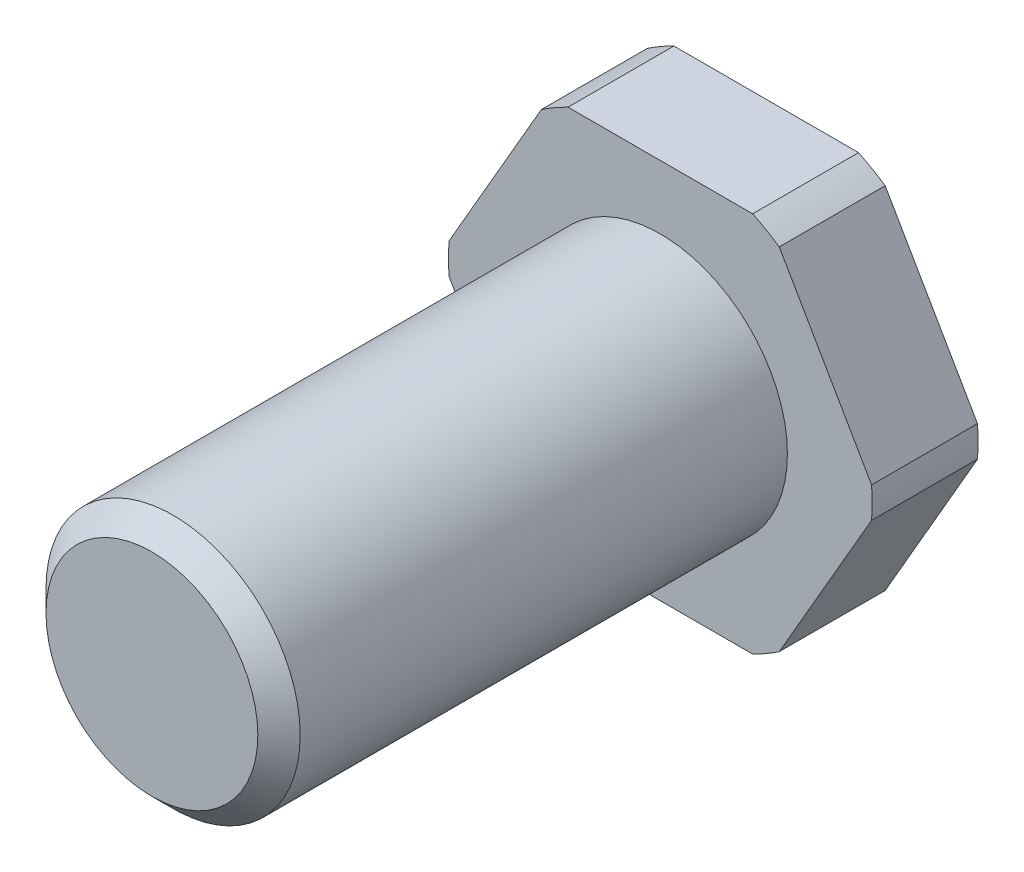
ISO-10303-21;
HEADER;
FILE_DESCRIPTION(('STEP AP214'),'2;1');
FILE_NAME('part.step','',(''),(''),'','','');
FILE_SCHEMA(('AUTOMOTIVE_DESIGN { 1 0 10303 214 1 1 1 1 }'));
ENDSEC;
DATA;
#1=APPLICATION_CONTEXT('core data for automotive mechanical design processes');
#2=APPLICATION_PROTOCOL_DEFINITION('international standard','automotive_design',2000,#1);
#3=PRODUCT_CONTEXT('',#1,'mechanical');
#4=PRODUCT('Part','Part','',(#3));
#5=PRODUCT_RELATED_PRODUCT_CATEGORY('part','',(#4));
#6=PRODUCT_DEFINITION_FORMATION('','',#4);
#7=PRODUCT_DEFINITION_CONTEXT('part definition',#1,'design');
#8=PRODUCT_DEFINITION('design','',#6,#7);
#9=PRODUCT_DEFINITION_SHAPE('','',#8);
#10=(LENGTH_UNIT() NAMED_UNIT(*) SI_UNIT(.MILLI.,.METRE.));
#11=(NAMED_UNIT(*) PLANE_ANGLE_UNIT() SI_UNIT($,.RADIAN.));
#12=(NAMED_UNIT(*) SI_UNIT($,.STERADIAN.) SOLID_ANGLE_UNIT());
#13=UNCERTAINTY_MEASURE_WITH_UNIT(LENGTH_MEASURE(1.E-05),#10,'distance_accuracy_value','');
#14=(GEOMETRIC_REPRESENTATION_CONTEXT(3) GLOBAL_UNCERTAINTY_ASSIGNED_CONTEXT((#13)) GLOBAL_UNIT_ASSIGNED_CONTEXT((#10,
#11,#12)) REPRESENTATION_CONTEXT('',''));
#15=CARTESIAN_POINT('',(0.,0.,0.));
#16=DIRECTION('',(0.,0.,1.));
#17=DIRECTION('',(1.,0.,0.));
#18=AXIS2_PLACEMENT_3D('',#15,#16,#17);
#19=CARTESIAN_POINT('',(10.3923048454133,0.,5.));
#20=DIRECTION('',(0.,0.,1.));
#21=DIRECTION('',(1.,0.,0.));
#22=AXIS2_PLACEMENT_3D('',#19,#20,#21);
#23=PLANE('',#22);
#24=CARTESIAN_POINT('',(0.,0.,5.));
#25=DIRECTION('',(0.,0.,1.));
#26=DIRECTION('',(1.,0.,0.));
#27=AXIS2_PLACEMENT_3D('',#24,#25,#26);
#28=CIRCLE('',#27,6.);
#29=CARTESIAN_POINT('',(6.,0.,5.));
#30=VERTEX_POINT('',#29);
#31=EDGE_CURVE('E157',#30,#30,#28,.T.);
#32=ORIENTED_EDGE('',*,*,#31,.F.);
#33=EDGE_LOOP('',(#32));
#34=FACE_BOUND('',#33,.T.);
#35=DIRECTION('',(-0.5,0.866025403784438,0.));
#36=VECTOR('',#35,1.);
#37=CARTESIAN_POINT('',(10.3923048454133,0.,5.));
#38=LINE('',#37,#36);
#39=CARTESIAN_POINT('',(9.97367810583028,0.72508278236463,5.));
#40=VERTEX_POINT('',#39);
#41=CARTESIAN_POINT('',(5.61477916228961,8.27491721763537,5.));
#42=VERTEX_POINT('',#41);
#43=EDGE_CURVE('E147',#40,#42,#38,.T.);
#44=ORIENTED_EDGE('',*,*,#43,.T.);
#45=CARTESIAN_POINT('',(0.,0.,5.));
#46=DIRECTION('',(0.,0.,1.));
#47=DIRECTION('',(1.,0.,0.));
#48=AXIS2_PLACEMENT_3D('',#45,#46,#47);
#49=CIRCLE('',#48,10.);
#50=CARTESIAN_POINT('',(4.35889894354067,9.,5.));
#51=VERTEX_POINT('',#50);
#52=EDGE_CURVE('E226',#42,#51,#49,.T.);
#53=ORIENTED_EDGE('',*,*,#52,.T.);
#54=DIRECTION('',(-1.,0.,0.));
#55=VECTOR('',#54,1.);
#56=CARTESIAN_POINT('',(5.19615242270663,9.,5.));
#57=LINE('',#56,#55);
#58=CARTESIAN_POINT('',(-4.35889894354067,9.,5.));
#59=VERTEX_POINT('',#58);
#60=EDGE_CURVE('E209',#51,#59,#57,.T.);
#61=ORIENTED_EDGE('',*,*,#60,.T.);
#62=CARTESIAN_POINT('',(-5.61477916228962,8.27491721763537,5.));
#63=VERTEX_POINT('',#62);
#64=EDGE_CURVE('E231',#59,#63,#49,.T.);
#65=ORIENTED_EDGE('',*,*,#64,.T.);
#66=DIRECTION('',(-0.5,-0.866025403784439,0.));
#67=VECTOR('',#66,1.);
#68=CARTESIAN_POINT('',(-5.19615242270663,9.,5.));
#69=LINE('',#68,#67);
#70=CARTESIAN_POINT('',(-9.97367810583028,0.725082782364628,5.));
#71=VERTEX_POINT('',#70);
#72=EDGE_CURVE('E212',#63,#71,#69,.T.);
#73=ORIENTED_EDGE('',*,*,#72,.T.);
#74=CARTESIAN_POINT('',(-9.97367810583028,-0.725082782364632,5.));
#75=VERTEX_POINT('',#74);
#76=EDGE_CURVE('E258',#71,#75,#49,.T.);
#77=ORIENTED_EDGE('',*,*,#76,.T.);
#78=DIRECTION('',(0.5,-0.866025403784439,0.));
#79=VECTOR('',#78,1.);
#80=CARTESIAN_POINT('',(-10.3923048454133,0.,5.));
#81=LINE('',#80,#79);
#82=CARTESIAN_POINT('',(-5.61477916228961,-8.27491721763537,5.));
#83=VERTEX_POINT('',#82);
#84=EDGE_CURVE('E215',#75,#83,#81,.T.);
#85=ORIENTED_EDGE('',*,*,#84,.T.);
#86=CARTESIAN_POINT('',(-4.35889894354067,-9.00000000000001,5.));
#87=VERTEX_POINT('',#86);
#88=EDGE_CURVE('E222',#83,#87,#49,.T.);
#89=ORIENTED_EDGE('',*,*,#88,.T.);
#90=DIRECTION('',(1.,0.,0.));
#91=VECTOR('',#90,1.);
#92=CARTESIAN_POINT('',(-5.19615242270663,-9.00000000000001,5.));
#93=LINE('',#92,#91);
#94=CARTESIAN_POINT('',(4.35889894354067,-9.,5.));
#95=VERTEX_POINT('',#94);
#96=EDGE_CURVE('E138',#87,#95,#93,.T.);
#97=ORIENTED_EDGE('',*,*,#96,.T.);
#98=CARTESIAN_POINT('',(5.61477916228962,-8.27491721763537,5.));
#99=VERTEX_POINT('',#98);
#100=EDGE_CURVE('E221',#95,#99,#49,.T.);
#101=ORIENTED_EDGE('',*,*,#100,.T.);
#102=DIRECTION('',(0.5,0.866025403784439,0.));
#103=VECTOR('',#102,1.);
#104=CARTESIAN_POINT('',(5.19615242270664,-9.,5.));
#105=LINE('',#104,#103);
#106=CARTESIAN_POINT('',(9.97367810583028,-0.725082782364636,5.));
#107=VERTEX_POINT('',#106);
#108=EDGE_CURVE('E168',#99,#107,#105,.T.);
#109=ORIENTED_EDGE('',*,*,#108,.T.);
#110=EDGE_CURVE('E233',#107,#40,#49,.T.);
#111=ORIENTED_EDGE('',*,*,#110,.T.);
#112=EDGE_LOOP('',(#44,#53,#61,#65,#73,#77,#85,#89,#97,#101,#109,#111));
#113=FACE_BOUND('',#112,.T.);
#114=ADVANCED_FACE('F35',(#34,#113),#23,.T.);
#115=CARTESIAN_POINT('',(5.19615242270664,-9.,5.));
#116=DIRECTION('',(-0.866025403784439,0.5,0.));
#117=DIRECTION('',(-0.5,-0.866025403784439,0.));
#118=AXIS2_PLACEMENT_3D('',#115,#116,#117);
#119=PLANE('',#118);
#120=DIRECTION('',(0.,0.,1.));
#121=VECTOR('',#120,1.);
#122=CARTESIAN_POINT('',(5.61477916228962,-8.27491721763537,0.));
#123=LINE('',#122,#121);
#124=CARTESIAN_POINT('',(5.61477916228962,-8.27491721763537,0.));
#125=VERTEX_POINT('',#124);
#126=EDGE_CURVE('E187',#125,#99,#123,.T.);
#127=ORIENTED_EDGE('',*,*,#126,.F.);
#128=DIRECTION('',(0.5,0.866025403784439,0.));
#129=VECTOR('',#128,1.);
#130=CARTESIAN_POINT('',(5.19615242270664,-9.,0.));
#131=LINE('',#130,#129);
#132=CARTESIAN_POINT('',(9.97367810583028,-0.725082782364633,0.));
#133=VERTEX_POINT('',#132);
#134=EDGE_CURVE('E152',#125,#133,#131,.T.);
#135=ORIENTED_EDGE('',*,*,#134,.T.);
#136=DIRECTION('',(0.,0.,1.));
#137=VECTOR('',#136,1.);
#138=CARTESIAN_POINT('',(9.97367810583028,-0.725082782364636,0.));
#139=LINE('',#138,#137);
#140=EDGE_CURVE('E132',#107,#133,#139,.F.);
#141=ORIENTED_EDGE('',*,*,#140,.F.);
#142=ORIENTED_EDGE('',*,*,#108,.F.);
#143=EDGE_LOOP('',(#127,#135,#141,#142));
#144=FACE_BOUND('',#143,.T.);
#145=ADVANCED_FACE('F194',(#144),#119,.F.);
#146=CARTESIAN_POINT('',(10.3923048454133,0.,5.));
#147=DIRECTION('',(-0.866025403784438,-0.5,0.));
#148=DIRECTION('',(0.5,-0.866025403784439,0.));
#149=AXIS2_PLACEMENT_3D('',#146,#147,#148);
#150=PLANE('',#149);
#151=DIRECTION('',(0.,0.,1.));
#152=VECTOR('',#151,1.);
#153=CARTESIAN_POINT('',(9.97367810583028,0.72508278236463,0.));
#154=LINE('',#153,#152);
#155=CARTESIAN_POINT('',(9.97367810583028,0.72508278236463,0.));
#156=VERTEX_POINT('',#155);
#157=EDGE_CURVE('E129',#156,#40,#154,.T.);
#158=ORIENTED_EDGE('',*,*,#157,.F.);
#159=DIRECTION('',(-0.5,0.866025403784438,0.));
#160=VECTOR('',#159,1.);
#161=CARTESIAN_POINT('',(10.3923048454133,0.,0.));
#162=LINE('',#161,#160);
#163=CARTESIAN_POINT('',(5.61477916228961,8.27491721763537,0.));
#164=VERTEX_POINT('',#163);
#165=EDGE_CURVE('E145',#156,#164,#162,.T.);
#166=ORIENTED_EDGE('',*,*,#165,.T.);
#167=DIRECTION('',(0.,0.,1.));
#168=VECTOR('',#167,1.);
#169=CARTESIAN_POINT('',(5.61477916228961,8.27491721763537,0.));
#170=LINE('',#169,#168);
#171=EDGE_CURVE('E50',#42,#164,#170,.F.);
#172=ORIENTED_EDGE('',*,*,#171,.F.);
#173=ORIENTED_EDGE('',*,*,#43,.F.);
#174=EDGE_LOOP('',(#158,#166,#172,#173));
#175=FACE_BOUND('',#174,.T.);
#176=ADVANCED_FACE('F144',(#175),#150,.F.);
#177=CARTESIAN_POINT('',(5.19615242270663,9.,5.));
#178=DIRECTION('',(0.,-1.,0.));
#179=DIRECTION('',(1.,0.,0.));
#180=AXIS2_PLACEMENT_3D('',#177,#178,#179);
#181=PLANE('',#180);
#182=DIRECTION('',(0.,0.,1.));
#183=VECTOR('',#182,1.);
#184=CARTESIAN_POINT('',(4.35889894354067,9.,0.));
#185=LINE('',#184,#183);
#186=CARTESIAN_POINT('',(4.35889894354067,9.,0.));
#187=VERTEX_POINT('',#186);
#188=EDGE_CURVE('E243',#187,#51,#185,.T.);
#189=ORIENTED_EDGE('',*,*,#188,.F.);
#190=DIRECTION('',(-1.,0.,0.));
#191=VECTOR('',#190,1.);
#192=CARTESIAN_POINT('',(5.19615242270663,9.,0.));
#193=LINE('',#192,#191);
#194=CARTESIAN_POINT('',(-4.35889894354067,9.,0.));
#195=VERTEX_POINT('',#194);
#196=EDGE_CURVE('E151',#187,#195,#193,.T.);
#197=ORIENTED_EDGE('',*,*,#196,.T.);
#198=DIRECTION('',(0.,0.,1.));
#199=VECTOR('',#198,1.);
#200=CARTESIAN_POINT('',(-4.35889894354067,9.,0.));
#201=LINE('',#200,#199);
#202=EDGE_CURVE('E58',#59,#195,#201,.F.);
#203=ORIENTED_EDGE('',*,*,#202,.F.);
#204=ORIENTED_EDGE('',*,*,#60,.F.);
#205=EDGE_LOOP('',(#189,#197,#203,#204));
#206=FACE_BOUND('',#205,.T.);
#207=ADVANCED_FACE('F249',(#206),#181,.F.);
#208=CARTESIAN_POINT('',(-5.19615242270663,9.,5.));
#209=DIRECTION('',(0.866025403784439,-0.5,0.));
#210=DIRECTION('',(0.5,0.866025403784439,0.));
#211=AXIS2_PLACEMENT_3D('',#208,#209,#210);
#212=PLANE('',#211);
#213=DIRECTION('',(0.,0.,1.));
#214=VECTOR('',#213,1.);
#215=CARTESIAN_POINT('',(-5.61477916228962,8.27491721763537,0.));
#216=LINE('',#215,#214);
#217=CARTESIAN_POINT('',(-5.61477916228961,8.27491721763537,0.));
#218=VERTEX_POINT('',#217);
#219=EDGE_CURVE('E240',#218,#63,#216,.T.);
#220=ORIENTED_EDGE('',*,*,#219,.F.);
#221=DIRECTION('',(-0.5,-0.866025403784439,0.));
#222=VECTOR('',#221,1.);
#223=CARTESIAN_POINT('',(-5.19615242270663,9.,0.));
#224=LINE('',#223,#222);
#225=CARTESIAN_POINT('',(-9.97367810583028,0.725082782364626,0.));
#226=VERTEX_POINT('',#225);
#227=EDGE_CURVE('E155',#218,#226,#224,.T.);
#228=ORIENTED_EDGE('',*,*,#227,.T.);
#229=DIRECTION('',(0.,0.,1.));
#230=VECTOR('',#229,1.);
#231=CARTESIAN_POINT('',(-9.97367810583028,0.725082782364628,0.));
#232=LINE('',#231,#230);
#233=EDGE_CURVE('E238',#71,#226,#232,.F.);
#234=ORIENTED_EDGE('',*,*,#233,.F.);
#235=ORIENTED_EDGE('',*,*,#72,.F.);
#236=EDGE_LOOP('',(#220,#228,#234,#235));
#237=FACE_BOUND('',#236,.T.);
#238=ADVANCED_FACE('F254',(#237),#212,.F.);
#239=CARTESIAN_POINT('',(-10.3923048454133,0.,5.));
#240=DIRECTION('',(0.866025403784439,0.5,0.));
#241=DIRECTION('',(-0.5,0.866025403784439,0.));
#242=AXIS2_PLACEMENT_3D('',#239,#240,#241);
#243=PLANE('',#242);
#244=DIRECTION('',(0.,0.,1.));
#245=VECTOR('',#244,1.);
#246=CARTESIAN_POINT('',(-9.97367810583028,-0.725082782364632,0.));
#247=LINE('',#246,#245);
#248=CARTESIAN_POINT('',(-9.97367810583028,-0.725082782364631,0.));
#249=VERTEX_POINT('',#248);
#250=EDGE_CURVE('E236',#249,#75,#247,.T.);
#251=ORIENTED_EDGE('',*,*,#250,.F.);
#252=DIRECTION('',(0.5,-0.866025403784439,0.));
#253=VECTOR('',#252,1.);
#254=CARTESIAN_POINT('',(-10.3923048454133,0.,0.));
#255=LINE('',#254,#253);
#256=CARTESIAN_POINT('',(-5.61477916228962,-8.27491721763537,0.));
#257=VERTEX_POINT('',#256);
#258=EDGE_CURVE('E163',#249,#257,#255,.T.);
#259=ORIENTED_EDGE('',*,*,#258,.T.);
#260=DIRECTION('',(0.,0.,1.));
#261=VECTOR('',#260,1.);
#262=CARTESIAN_POINT('',(-5.61477916228961,-8.27491721763537,0.));
#263=LINE('',#262,#261);
#264=EDGE_CURVE('E228',#83,#257,#263,.F.);
#265=ORIENTED_EDGE('',*,*,#264,.F.);
#266=ORIENTED_EDGE('',*,*,#84,.F.);
#267=EDGE_LOOP('',(#251,#259,#265,#266));
#268=FACE_BOUND('',#267,.T.);
#269=ADVANCED_FACE('F262',(#268),#243,.F.);
#270=CARTESIAN_POINT('',(-5.19615242270663,-9.00000000000001,5.));
#271=DIRECTION('',(0.,1.,0.));
#272=DIRECTION('',(-1.,0.,0.));
#273=AXIS2_PLACEMENT_3D('',#270,#271,#272);
#274=PLANE('',#273);
#275=DIRECTION('',(0.,0.,1.));
#276=VECTOR('',#275,1.);
#277=CARTESIAN_POINT('',(-4.35889894354067,-9.00000000000001,0.));
#278=LINE('',#277,#276);
#279=CARTESIAN_POINT('',(-4.35889894354067,-9.00000000000001,0.));
#280=VERTEX_POINT('',#279);
#281=EDGE_CURVE('E225',#280,#87,#278,.T.);
#282=ORIENTED_EDGE('',*,*,#281,.F.);
#283=DIRECTION('',(1.,0.,0.));
#284=VECTOR('',#283,1.);
#285=CARTESIAN_POINT('',(-5.19615242270663,-9.00000000000001,0.));
#286=LINE('',#285,#284);
#287=CARTESIAN_POINT('',(4.35889894354067,-9.,0.));
#288=VERTEX_POINT('',#287);
#289=EDGE_CURVE('E166',#280,#288,#286,.T.);
#290=ORIENTED_EDGE('',*,*,#289,.T.);
#291=DIRECTION('',(0.,0.,1.));
#292=VECTOR('',#291,1.);
#293=CARTESIAN_POINT('',(4.35889894354067,-9.,0.));
#294=LINE('',#293,#292);
#295=EDGE_CURVE('E190',#95,#288,#294,.F.);
#296=ORIENTED_EDGE('',*,*,#295,.F.);
#297=ORIENTED_EDGE('',*,*,#96,.F.);
#298=EDGE_LOOP('',(#282,#290,#296,#297));
#299=FACE_BOUND('',#298,.T.);
#300=ADVANCED_FACE('F224',(#299),#274,.F.);
#301=CARTESIAN_POINT('',(10.3923048454133,0.,0.));
#302=DIRECTION('',(0.,0.,1.));
#303=DIRECTION('',(1.,0.,0.));
#304=AXIS2_PLACEMENT_3D('',#301,#302,#303);
#305=PLANE('',#304);
#306=CARTESIAN_POINT('',(0.,0.,0.));
#307=DIRECTION('',(0.,0.,-1.));
#308=DIRECTION('',(-1.,0.,0.));
#309=AXIS2_PLACEMENT_3D('',#306,#307,#308);
#310=CIRCLE('',#309,3.39999999999999);
#311=CARTESIAN_POINT('',(-3.39999999999999,0.,0.));
#312=VERTEX_POINT('',#311);
#313=EDGE_CURVE('E196',#312,#312,#310,.T.);
#314=ORIENTED_EDGE('',*,*,#313,.F.);
#315=EDGE_LOOP('',(#314));
#316=FACE_BOUND('',#315,.T.);
#317=CARTESIAN_POINT('',(0.,0.,0.));
#318=DIRECTION('',(0.,0.,1.));
#319=DIRECTION('',(1.,0.,0.));
#320=AXIS2_PLACEMENT_3D('',#317,#318,#319);
#321=CIRCLE('',#320,10.);
#322=EDGE_CURVE('E140',#164,#187,#321,.T.);
#323=ORIENTED_EDGE('',*,*,#322,.F.);
#324=ORIENTED_EDGE('',*,*,#165,.F.);
#325=EDGE_CURVE('E126',#133,#156,#321,.T.);
#326=ORIENTED_EDGE('',*,*,#325,.F.);
#327=ORIENTED_EDGE('',*,*,#134,.F.);
#328=EDGE_CURVE('E137',#288,#125,#321,.T.);
#329=ORIENTED_EDGE('',*,*,#328,.F.);
#330=ORIENTED_EDGE('',*,*,#289,.F.);
#331=EDGE_CURVE('E176',#257,#280,#321,.T.);
#332=ORIENTED_EDGE('',*,*,#331,.F.);
#333=ORIENTED_EDGE('',*,*,#258,.F.);
#334=EDGE_CURVE('E174',#226,#249,#321,.T.);
#335=ORIENTED_EDGE('',*,*,#334,.F.);
#336=ORIENTED_EDGE('',*,*,#227,.F.);
#337=EDGE_CURVE('E172',#195,#218,#321,.T.);
#338=ORIENTED_EDGE('',*,*,#337,.F.);
#339=ORIENTED_EDGE('',*,*,#196,.F.);
#340=EDGE_LOOP('',(#323,#324,#326,#327,#329,#330,#332,#333,#335,#336,#338,#339));
#341=FACE_BOUND('',#340,.T.);
#342=ADVANCED_FACE('F149',(#316,#341),#305,.F.);
#343=CARTESIAN_POINT('',(0.,0.,29.));
#344=DIRECTION('',(0.,0.,-1.));
#345=DIRECTION('',(-1.,0.,0.));
#346=AXIS2_PLACEMENT_3D('',#343,#344,#345);
#347=CYLINDRICAL_SURFACE('',#346,6.);
#348=CARTESIAN_POINT('',(0.,0.,28.));
#349=DIRECTION('',(0.,0.,1.));
#350=DIRECTION('',(1.,0.,0.));
#351=AXIS2_PLACEMENT_3D('',#348,#349,#350);
#352=CIRCLE('',#351,6.);
#353=CARTESIAN_POINT('',(6.,0.,28.));
#354=VERTEX_POINT('',#353);
#355=EDGE_CURVE('E12',#354,#354,#352,.F.);
#356=ORIENTED_EDGE('',*,*,#355,.T.);
#357=EDGE_LOOP('',(#356));
#358=FACE_BOUND('',#357,.T.);
#359=ORIENTED_EDGE('',*,*,#31,.T.);
#360=EDGE_LOOP('',(#359));
#361=FACE_BOUND('',#360,.T.);
#362=ADVANCED_FACE('F281',(#358,#361),#347,.T.);
#363=CARTESIAN_POINT('',(0.,0.,29.));
#364=DIRECTION('',(0.,0.,1.));
#365=DIRECTION('',(1.,0.,0.));
#366=AXIS2_PLACEMENT_3D('',#363,#364,#365);
#367=PLANE('',#366);
#368=CARTESIAN_POINT('',(0.,0.,29.));
#369=DIRECTION('',(0.,0.,1.));
#370=DIRECTION('',(1.,0.,0.));
#371=AXIS2_PLACEMENT_3D('',#368,#369,#370);
#372=CIRCLE('',#371,5.);
#373=CARTESIAN_POINT('',(5.,0.,29.));
#374=VERTEX_POINT('',#373);
#375=EDGE_CURVE('E43',#374,#374,#372,.T.);
#376=ORIENTED_EDGE('',*,*,#375,.T.);
#377=EDGE_LOOP('',(#376));
#378=FACE_BOUND('',#377,.T.);
#379=ADVANCED_FACE('F326',(#378),#367,.T.);
#380=CARTESIAN_POINT('',(0.,0.,15.));
#381=DIRECTION('',(0.,0.,-1.));
#382=DIRECTION('',(-1.,0.,0.));
#383=AXIS2_PLACEMENT_3D('',#380,#381,#382);
#384=CONICAL_SURFACE('',#383,3.4,1.02974425867665);
#385=CARTESIAN_POINT('',(0.,0.,17.0429261046937));
#386=VERTEX_POINT('',#385);
#387=VERTEX_LOOP('',#386);
#388=FACE_BOUND('',#387,.T.);
#389=CARTESIAN_POINT('',(0.,0.,15.));
#390=DIRECTION('',(0.,0.,-1.));
#391=DIRECTION('',(-1.,0.,0.));
#392=AXIS2_PLACEMENT_3D('',#389,#390,#391);
#393=CIRCLE('',#392,3.4);
#394=CARTESIAN_POINT('',(-3.4,0.,15.));
#395=VERTEX_POINT('',#394);
#396=EDGE_CURVE('E199',#395,#395,#393,.T.);
#397=ORIENTED_EDGE('',*,*,#396,.T.);
#398=EDGE_LOOP('',(#397));
#399=FACE_BOUND('',#398,.T.);
#400=ADVANCED_FACE('F334',(#388,#399),#384,.F.);
#401=CARTESIAN_POINT('',(0.,0.,0.));
#402=DIRECTION('',(0.,0.,-1.));
#403=DIRECTION('',(-1.,0.,0.));
#404=AXIS2_PLACEMENT_3D('',#401,#402,#403);
#405=CYLINDRICAL_SURFACE('',#404,3.39999999999999);
#406=ORIENTED_EDGE('',*,*,#396,.F.);
#407=EDGE_LOOP('',(#406));
#408=FACE_BOUND('',#407,.T.);
#409=ORIENTED_EDGE('',*,*,#313,.T.);
#410=EDGE_LOOP('',(#409));
#411=FACE_BOUND('',#410,.T.);
#412=ADVANCED_FACE('F341',(#408,#411),#405,.F.);
#413=CARTESIAN_POINT('',(0.,0.,0.));
#414=DIRECTION('',(0.,0.,1.));
#415=DIRECTION('',(1.,0.,0.));
#416=AXIS2_PLACEMENT_3D('',#413,#414,#415);
#417=CYLINDRICAL_SURFACE('',#416,10.);
#418=ORIENTED_EDGE('',*,*,#140,.T.);
#419=ORIENTED_EDGE('',*,*,#325,.T.);
#420=ORIENTED_EDGE('',*,*,#157,.T.);
#421=ORIENTED_EDGE('',*,*,#110,.F.);
#422=EDGE_LOOP('',(#418,#419,#420,#421));
#423=FACE_BOUND('',#422,.T.);
#424=ADVANCED_FACE('F128',(#423),#417,.T.);
#425=ORIENTED_EDGE('',*,*,#126,.T.);
#426=ORIENTED_EDGE('',*,*,#100,.F.);
#427=ORIENTED_EDGE('',*,*,#295,.T.);
#428=ORIENTED_EDGE('',*,*,#328,.T.);
#429=EDGE_LOOP('',(#425,#426,#427,#428));
#430=FACE_BOUND('',#429,.T.);
#431=ADVANCED_FACE('F186',(#430),#417,.T.);
#432=ORIENTED_EDGE('',*,*,#264,.T.);
#433=ORIENTED_EDGE('',*,*,#331,.T.);
#434=ORIENTED_EDGE('',*,*,#281,.T.);
#435=ORIENTED_EDGE('',*,*,#88,.F.);
#436=EDGE_LOOP('',(#432,#433,#434,#435));
#437=FACE_BOUND('',#436,.T.);
#438=ADVANCED_FACE('F263',(#437),#417,.T.);
#439=ORIENTED_EDGE('',*,*,#233,.T.);
#440=ORIENTED_EDGE('',*,*,#334,.T.);
#441=ORIENTED_EDGE('',*,*,#250,.T.);
#442=ORIENTED_EDGE('',*,*,#76,.F.);
#443=EDGE_LOOP('',(#439,#440,#441,#442));
#444=FACE_BOUND('',#443,.T.);
#445=ADVANCED_FACE('F265',(#444),#417,.T.);
#446=ORIENTED_EDGE('',*,*,#202,.T.);
#447=ORIENTED_EDGE('',*,*,#337,.T.);
#448=ORIENTED_EDGE('',*,*,#219,.T.);
#449=ORIENTED_EDGE('',*,*,#64,.F.);
#450=EDGE_LOOP('',(#446,#447,#448,#449));
#451=FACE_BOUND('',#450,.T.);
#452=ADVANCED_FACE('F256',(#451),#417,.T.);
#453=ORIENTED_EDGE('',*,*,#171,.T.);
#454=ORIENTED_EDGE('',*,*,#322,.T.);
#455=ORIENTED_EDGE('',*,*,#188,.T.);
#456=ORIENTED_EDGE('',*,*,#52,.F.);
#457=EDGE_LOOP('',(#453,#454,#455,#456));
#458=FACE_BOUND('',#457,.T.);
#459=ADVANCED_FACE('F245',(#458),#417,.T.);
#460=CARTESIAN_POINT('',(0.,0.,29.));
#461=DIRECTION('',(0.,0.,-1.));
#462=DIRECTION('',(-1.,0.,0.));
#463=AXIS2_PLACEMENT_3D('',#460,#461,#462);
#464=CONICAL_SURFACE('',#463,5.,0.785398163397446);
#465=ORIENTED_EDGE('',*,*,#355,.F.);
#466=EDGE_LOOP('',(#465));
#467=FACE_BOUND('',#466,.T.);
#468=ORIENTED_EDGE('',*,*,#375,.F.);
#469=EDGE_LOOP('',(#468));
#470=FACE_BOUND('',#469,.T.);
#471=ADVANCED_FACE('F37',(#467,#470),#464,.T.);
#472=CLOSED_SHELL('',(#114,#145,#176,#207,#238,#269,#300,#342,#362,#379,#400,#412,#424,#431,
#438,#445,#452,#459,#471));
#473=MANIFOLD_SOLID_BREP('B2',#472);
#474=ADVANCED_BREP_SHAPE_REPRESENTATION('',(#18,#473),#14);
#475=SHAPE_DEFINITION_REPRESENTATION(#9,#474);
ENDSEC;
END-ISO-10303-21;
